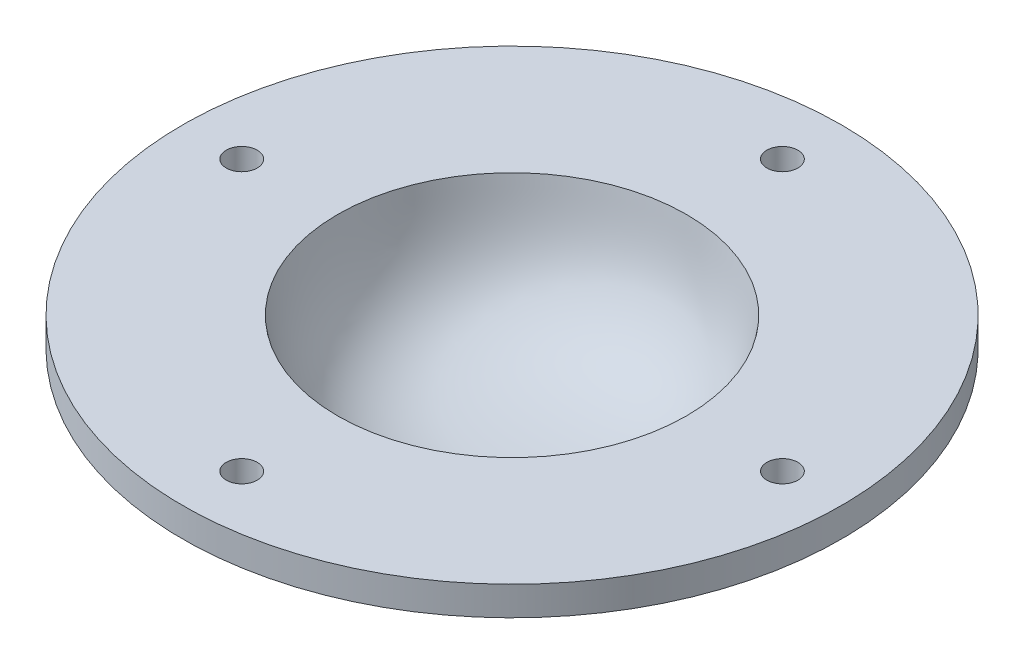
ISO-10303-21;
HEADER;
FILE_DESCRIPTION(('STEP AP214'),'2;1');
FILE_NAME('part.step','',(''),(''),'','','');
FILE_SCHEMA(('AUTOMOTIVE_DESIGN { 1 0 10303 214 1 1 1 1 }'));
ENDSEC;
DATA;
#1=APPLICATION_CONTEXT('core data for automotive mechanical design processes');
#2=APPLICATION_PROTOCOL_DEFINITION('international standard','automotive_design',2000,#1);
#3=PRODUCT_CONTEXT('',#1,'mechanical');
#4=PRODUCT('Part','Part','',(#3));
#5=PRODUCT_RELATED_PRODUCT_CATEGORY('part','',(#4));
#6=PRODUCT_DEFINITION_FORMATION('','',#4);
#7=PRODUCT_DEFINITION_CONTEXT('part definition',#1,'design');
#8=PRODUCT_DEFINITION('design','',#6,#7);
#9=PRODUCT_DEFINITION_SHAPE('','',#8);
#10=(LENGTH_UNIT() NAMED_UNIT(*) SI_UNIT(.MILLI.,.METRE.));
#11=(NAMED_UNIT(*) PLANE_ANGLE_UNIT() SI_UNIT($,.RADIAN.));
#12=(NAMED_UNIT(*) SI_UNIT($,.STERADIAN.) SOLID_ANGLE_UNIT());
#13=UNCERTAINTY_MEASURE_WITH_UNIT(LENGTH_MEASURE(1.E-05),#10,'distance_accuracy_value','');
#14=(GEOMETRIC_REPRESENTATION_CONTEXT(3) GLOBAL_UNCERTAINTY_ASSIGNED_CONTEXT((#13)) GLOBAL_UNIT_ASSIGNED_CONTEXT((#10,
#11,#12)) REPRESENTATION_CONTEXT('',''));
#15=CARTESIAN_POINT('',(0.,0.,0.));
#16=DIRECTION('',(0.,0.,1.));
#17=DIRECTION('',(1.,0.,0.));
#18=AXIS2_PLACEMENT_3D('',#15,#16,#17);
#19=CARTESIAN_POINT('',(18.,0.,0.));
#20=CARTESIAN_POINT('',(17.019517420698,-6.05480984523951,0.));
#21=CARTESIAN_POINT('',(16.3895391420194,-14.,0.));
#22=CARTESIAN_POINT('',(0.,-14.,0.));
#23=B_SPLINE_CURVE_WITH_KNOTS('',3,(#19,#20,#21,#22),.UNSPECIFIED.,.F.,.F.,(4,4),(0.,1.),.UNSPECIFIED.);
#24=CARTESIAN_POINT('',(0.,-17.,0.));
#25=DIRECTION('',(0.,-1.,0.));
#26=AXIS1_PLACEMENT('',#24,#25);
#27=SURFACE_OF_REVOLUTION('',#23,#26);
#28=CARTESIAN_POINT('',(0.,-14.,0.));
#29=VERTEX_POINT('',#28);
#30=VERTEX_LOOP('',#29);
#31=FACE_BOUND('',#30,.T.);
#32=CARTESIAN_POINT('',(0.,0.,0.));
#33=DIRECTION('',(0.,-1.,0.));
#34=DIRECTION('',(0.,0.,-1.));
#35=AXIS2_PLACEMENT_3D('',#32,#33,#34);
#36=CIRCLE('',#35,18.);
#37=CARTESIAN_POINT('',(0.,0.,-18.));
#38=VERTEX_POINT('',#37);
#39=EDGE_CURVE('E54',#38,#38,#36,.T.);
#40=ORIENTED_EDGE('',*,*,#39,.F.);
#41=EDGE_LOOP('',(#40));
#42=FACE_BOUND('',#41,.T.);
#43=ADVANCED_FACE('F35',(#31,#42),#27,.F.);
#44=CARTESIAN_POINT('',(18.,0.,0.));
#45=DIRECTION('',(0.,1.,0.));
#46=DIRECTION('',(0.,0.,1.));
#47=AXIS2_PLACEMENT_3D('',#44,#45,#46);
#48=PLANE('',#47);
#49=CARTESIAN_POINT('',(-27.888022687531,0.,-2.92111532371438E-13));
#50=DIRECTION('',(0.,-1.,0.));
#51=DIRECTION('',(-1.,0.,0.));
#52=AXIS2_PLACEMENT_3D('',#49,#50,#51);
#53=CIRCLE('',#52,1.6);
#54=CARTESIAN_POINT('',(-29.488022687531,0.,-3.08870642797885E-13));
#55=VERTEX_POINT('',#54);
#56=EDGE_CURVE('E91',#55,#55,#53,.T.);
#57=ORIENTED_EDGE('',*,*,#56,.T.);
#58=EDGE_LOOP('',(#57));
#59=FACE_BOUND('',#58,.T.);
#60=CARTESIAN_POINT('',(0.,0.,27.888022687531));
#61=DIRECTION('',(0.,-1.,0.));
#62=DIRECTION('',(0.,0.,1.));
#63=AXIS2_PLACEMENT_3D('',#60,#61,#62);
#64=CIRCLE('',#63,1.6);
#65=CARTESIAN_POINT('',(0.,0.,29.488022687531));
#66=VERTEX_POINT('',#65);
#67=EDGE_CURVE('E95',#66,#66,#64,.T.);
#68=ORIENTED_EDGE('',*,*,#67,.T.);
#69=EDGE_LOOP('',(#68));
#70=FACE_BOUND('',#69,.T.);
#71=CARTESIAN_POINT('',(27.888022687531,0.,0.));
#72=DIRECTION('',(0.,-1.,0.));
#73=DIRECTION('',(1.,0.,0.));
#74=AXIS2_PLACEMENT_3D('',#71,#72,#73);
#75=CIRCLE('',#74,1.6);
#76=CARTESIAN_POINT('',(29.488022687531,0.,1.0295688093209E-13));
#77=VERTEX_POINT('',#76);
#78=EDGE_CURVE('E99',#77,#77,#75,.T.);
#79=ORIENTED_EDGE('',*,*,#78,.T.);
#80=EDGE_LOOP('',(#79));
#81=FACE_BOUND('',#80,.T.);
#82=CARTESIAN_POINT('',(0.,0.,-27.888022687531));
#83=DIRECTION('',(0.,-1.,0.));
#84=DIRECTION('',(0.,0.,-1.));
#85=AXIS2_PLACEMENT_3D('',#82,#83,#84);
#86=CIRCLE('',#85,1.6);
#87=CARTESIAN_POINT('',(0.,0.,-29.488022687531));
#88=VERTEX_POINT('',#87);
#89=EDGE_CURVE('E102',#88,#88,#86,.T.);
#90=ORIENTED_EDGE('',*,*,#89,.T.);
#91=EDGE_LOOP('',(#90));
#92=FACE_BOUND('',#91,.T.);
#93=ORIENTED_EDGE('',*,*,#39,.T.);
#94=EDGE_LOOP('',(#93));
#95=FACE_BOUND('',#94,.T.);
#96=CARTESIAN_POINT('',(0.,0.,0.));
#97=DIRECTION('',(0.,-1.,0.));
#98=DIRECTION('',(0.,0.,-1.));
#99=AXIS2_PLACEMENT_3D('',#96,#97,#98);
#100=CIRCLE('',#99,34.);
#101=CARTESIAN_POINT('',(0.,0.,-34.));
#102=VERTEX_POINT('',#101);
#103=EDGE_CURVE('E60',#102,#102,#100,.T.);
#104=ORIENTED_EDGE('',*,*,#103,.F.);
#105=EDGE_LOOP('',(#104));
#106=FACE_BOUND('',#105,.T.);
#107=ADVANCED_FACE('F51',(#59,#70,#81,#92,#95,#106),#48,.T.);
#108=CARTESIAN_POINT('',(0.,0.,0.));
#109=DIRECTION('',(0.,-1.,0.));
#110=DIRECTION('',(0.,0.,-1.));
#111=AXIS2_PLACEMENT_3D('',#108,#109,#110);
#112=CYLINDRICAL_SURFACE('',#111,34.);
#113=ORIENTED_EDGE('',*,*,#103,.T.);
#114=EDGE_LOOP('',(#113));
#115=FACE_BOUND('',#114,.T.);
#116=CARTESIAN_POINT('',(0.,-3.,0.));
#117=DIRECTION('',(0.,-1.,0.));
#118=DIRECTION('',(0.,0.,-1.));
#119=AXIS2_PLACEMENT_3D('',#116,#117,#118);
#120=CIRCLE('',#119,34.);
#121=CARTESIAN_POINT('',(0.,-3.,-34.));
#122=VERTEX_POINT('',#121);
#123=EDGE_CURVE('E56',#122,#122,#120,.T.);
#124=ORIENTED_EDGE('',*,*,#123,.F.);
#125=EDGE_LOOP('',(#124));
#126=FACE_BOUND('',#125,.T.);
#127=ADVANCED_FACE('F80',(#115,#126),#112,.T.);
#128=CARTESIAN_POINT('',(34.,-3.,0.));
#129=DIRECTION('',(0.,-1.,0.));
#130=DIRECTION('',(0.,0.,-1.));
#131=AXIS2_PLACEMENT_3D('',#128,#129,#130);
#132=PLANE('',#131);
#133=CARTESIAN_POINT('',(-27.888022687531,-3.,-2.92111532371438E-13));
#134=DIRECTION('',(0.,-1.,0.));
#135=DIRECTION('',(-1.,0.,0.));
#136=AXIS2_PLACEMENT_3D('',#133,#134,#135);
#137=CIRCLE('',#136,1.6);
#138=CARTESIAN_POINT('',(-29.488022687531,-3.,-3.08870642797885E-13));
#139=VERTEX_POINT('',#138);
#140=EDGE_CURVE('E120',#139,#139,#137,.T.);
#141=ORIENTED_EDGE('',*,*,#140,.F.);
#142=EDGE_LOOP('',(#141));
#143=FACE_BOUND('',#142,.T.);
#144=CARTESIAN_POINT('',(0.,-3.,27.888022687531));
#145=DIRECTION('',(0.,-1.,0.));
#146=DIRECTION('',(0.,0.,1.));
#147=AXIS2_PLACEMENT_3D('',#144,#145,#146);
#148=CIRCLE('',#147,1.6);
#149=CARTESIAN_POINT('',(0.,-3.,29.488022687531));
#150=VERTEX_POINT('',#149);
#151=EDGE_CURVE('E116',#150,#150,#148,.T.);
#152=ORIENTED_EDGE('',*,*,#151,.F.);
#153=EDGE_LOOP('',(#152));
#154=FACE_BOUND('',#153,.T.);
#155=CARTESIAN_POINT('',(27.888022687531,-3.,0.));
#156=DIRECTION('',(0.,-1.,0.));
#157=DIRECTION('',(1.,0.,0.));
#158=AXIS2_PLACEMENT_3D('',#155,#156,#157);
#159=CIRCLE('',#158,1.6);
#160=CARTESIAN_POINT('',(29.488022687531,-3.,1.0295688093209E-13));
#161=VERTEX_POINT('',#160);
#162=EDGE_CURVE('E112',#161,#161,#159,.T.);
#163=ORIENTED_EDGE('',*,*,#162,.F.);
#164=EDGE_LOOP('',(#163));
#165=FACE_BOUND('',#164,.T.);
#166=CARTESIAN_POINT('',(0.,-3.,-27.888022687531));
#167=DIRECTION('',(0.,-1.,0.));
#168=DIRECTION('',(0.,0.,-1.));
#169=AXIS2_PLACEMENT_3D('',#166,#167,#168);
#170=CIRCLE('',#169,1.6);
#171=CARTESIAN_POINT('',(0.,-3.,-29.488022687531));
#172=VERTEX_POINT('',#171);
#173=EDGE_CURVE('E107',#172,#172,#170,.T.);
#174=ORIENTED_EDGE('',*,*,#173,.F.);
#175=EDGE_LOOP('',(#174));
#176=FACE_BOUND('',#175,.T.);
#177=CARTESIAN_POINT('',(0.,-3.,0.));
#178=DIRECTION('',(0.,-1.,0.));
#179=DIRECTION('',(0.,0.,-1.));
#180=AXIS2_PLACEMENT_3D('',#177,#178,#179);
#181=CIRCLE('',#180,21.776045375062);
#182=CARTESIAN_POINT('',(0.,-3.,-21.776045375062));
#183=VERTEX_POINT('',#182);
#184=EDGE_CURVE('E43',#183,#183,#181,.F.);
#185=ORIENTED_EDGE('',*,*,#184,.T.);
#186=EDGE_LOOP('',(#185));
#187=FACE_BOUND('',#186,.T.);
#188=ORIENTED_EDGE('',*,*,#123,.T.);
#189=EDGE_LOOP('',(#188));
#190=FACE_BOUND('',#189,.T.);
#191=ADVANCED_FACE('F78',(#143,#154,#165,#176,#187,#190),#132,.T.);
#192=CARTESIAN_POINT('',(0.,-17.,0.));
#193=CARTESIAN_POINT('',(0.528573752836525,-17.,0.));
#194=CARTESIAN_POINT('',(1.60538875399186,-16.9835695490281,0.));
#195=CARTESIAN_POINT('',(3.60016807695871,-16.8863796921405,0.));
#196=CARTESIAN_POINT('',(5.91598495905235,-16.646675198481,0.));
#197=CARTESIAN_POINT('',(8.40244271471685,-16.1751666483012,0.));
#198=CARTESIAN_POINT('',(11.3697157674622,-15.3056850901701,0.));
#199=CARTESIAN_POINT('',(14.4678638234042,-13.7682477977884,0.));
#200=CARTESIAN_POINT('',(17.2269544937281,-11.2724313232734,0.));
#201=CARTESIAN_POINT('',(19.0168311852011,-8.41451174983678,0.));
#202=CARTESIAN_POINT('',(20.0419714543231,-5.5311312404163,0.));
#203=CARTESIAN_POINT('',(20.5097393929316,-3.27722724217833,0.));
#204=CARTESIAN_POINT('',(20.7842286437848,-1.60538032197979,0.));
#205=CARTESIAN_POINT('',(20.8994271733386,-0.862400942202044,0.));
#206=CARTESIAN_POINT('',(20.9614228913724,-0.479556522690769,0.));
#207=B_SPLINE_CURVE_WITH_KNOTS('',3,(#192,#193,#194,#195,#196,#197,#198,#199,#200,#201,#202,
#203,#204,#205,#206),.UNSPECIFIED.,.F.,.F.,(4,1,1,1,1,1,1,1,1,1,1,1,4),(0.,0.03125,0.0625,0.125,
0.1875,0.25,0.375,0.5,0.625,0.75,0.875,0.9375,1.),.UNSPECIFIED.);
#208=CARTESIAN_POINT('',(0.,-17.,0.));
#209=DIRECTION('',(0.,-1.,0.));
#210=AXIS1_PLACEMENT('',#208,#209);
#211=SURFACE_OF_REVOLUTION('',#207,#210);
#212=CARTESIAN_POINT('',(0.,-4.17742916140524,0.));
#213=DIRECTION('',(0.,-1.,0.));
#214=DIRECTION('',(0.,0.,-1.));
#215=AXIS2_PLACEMENT_3D('',#212,#213,#214);
#216=CIRCLE('',#215,20.3111398989004);
#217=CARTESIAN_POINT('',(0.,-4.17742916140524,-20.3111398989004));
#218=VERTEX_POINT('',#217);
#219=EDGE_CURVE('E11',#218,#218,#216,.T.);
#220=ORIENTED_EDGE('',*,*,#219,.T.);
#221=EDGE_LOOP('',(#220));
#222=FACE_BOUND('',#221,.T.);
#223=CARTESIAN_POINT('',(0.,-17.,0.));
#224=VERTEX_POINT('',#223);
#225=VERTEX_LOOP('',#224);
#226=FACE_BOUND('',#225,.T.);
#227=ADVANCED_FACE('F74',(#222,#226),#211,.F.);
#228=CARTESIAN_POINT('',(0.,-4.49999999999999,0.));
#229=DIRECTION('',(0.,-1.,0.));
#230=DIRECTION('',(0.,0.,-1.));
#231=AXIS2_PLACEMENT_3D('',#228,#229,#230);
#232=TOROIDAL_SURFACE('',#231,21.776045375062,1.5);
#233=ORIENTED_EDGE('',*,*,#219,.F.);
#234=EDGE_LOOP('',(#233));
#235=FACE_BOUND('',#234,.T.);
#236=ORIENTED_EDGE('',*,*,#184,.F.);
#237=EDGE_LOOP('',(#236));
#238=FACE_BOUND('',#237,.T.);
#239=ADVANCED_FACE('F37',(#235,#238),#232,.F.);
#240=CARTESIAN_POINT('',(0.,0.,-27.888022687531));
#241=DIRECTION('',(0.,-1.,0.));
#242=DIRECTION('',(0.,0.,-1.));
#243=AXIS2_PLACEMENT_3D('',#240,#241,#242);
#244=CYLINDRICAL_SURFACE('',#243,1.6);
#245=ORIENTED_EDGE('',*,*,#89,.F.);
#246=EDGE_LOOP('',(#245));
#247=FACE_BOUND('',#246,.T.);
#248=ORIENTED_EDGE('',*,*,#173,.T.);
#249=EDGE_LOOP('',(#248));
#250=FACE_BOUND('',#249,.T.);
#251=ADVANCED_FACE('F141',(#247,#250),#244,.F.);
#252=CARTESIAN_POINT('',(27.888022687531,0.,0.));
#253=DIRECTION('',(0.,-1.,0.));
#254=DIRECTION('',(0.,0.,-1.));
#255=AXIS2_PLACEMENT_3D('',#252,#253,#254);
#256=CYLINDRICAL_SURFACE('',#255,1.6);
#257=ORIENTED_EDGE('',*,*,#78,.F.);
#258=EDGE_LOOP('',(#257));
#259=FACE_BOUND('',#258,.T.);
#260=ORIENTED_EDGE('',*,*,#162,.T.);
#261=EDGE_LOOP('',(#260));
#262=FACE_BOUND('',#261,.T.);
#263=ADVANCED_FACE('F146',(#259,#262),#256,.F.);
#264=CARTESIAN_POINT('',(0.,0.,27.888022687531));
#265=DIRECTION('',(0.,-1.,0.));
#266=DIRECTION('',(0.,0.,-1.));
#267=AXIS2_PLACEMENT_3D('',#264,#265,#266);
#268=CYLINDRICAL_SURFACE('',#267,1.6);
#269=ORIENTED_EDGE('',*,*,#67,.F.);
#270=EDGE_LOOP('',(#269));
#271=FACE_BOUND('',#270,.T.);
#272=ORIENTED_EDGE('',*,*,#151,.T.);
#273=EDGE_LOOP('',(#272));
#274=FACE_BOUND('',#273,.T.);
#275=ADVANCED_FACE('F153',(#271,#274),#268,.F.);
#276=CARTESIAN_POINT('',(-27.888022687531,0.,-2.92111532371438E-13));
#277=DIRECTION('',(0.,-1.,0.));
#278=DIRECTION('',(0.,0.,-1.));
#279=AXIS2_PLACEMENT_3D('',#276,#277,#278);
#280=CYLINDRICAL_SURFACE('',#279,1.6);
#281=ORIENTED_EDGE('',*,*,#56,.F.);
#282=EDGE_LOOP('',(#281));
#283=FACE_BOUND('',#282,.T.);
#284=ORIENTED_EDGE('',*,*,#140,.T.);
#285=EDGE_LOOP('',(#284));
#286=FACE_BOUND('',#285,.T.);
#287=ADVANCED_FACE('F125',(#283,#286),#280,.F.);
#288=CLOSED_SHELL('',(#43,#107,#127,#191,#227,#239,#251,#263,#275,#287));
#289=MANIFOLD_SOLID_BREP('B2',#288);
#290=ADVANCED_BREP_SHAPE_REPRESENTATION('',(#18,#289),#14);
#291=SHAPE_DEFINITION_REPRESENTATION(#9,#290);
ENDSEC;
END-ISO-10303-21;
